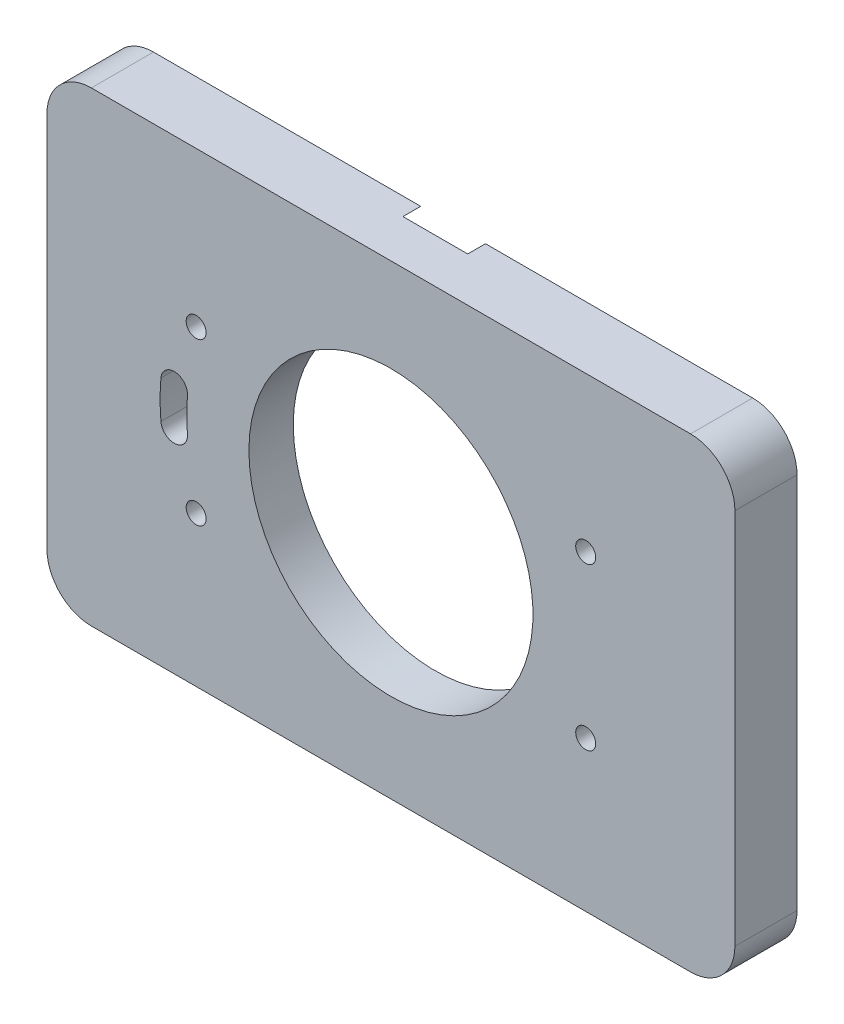
ISO-10303-21;
HEADER;
FILE_DESCRIPTION(('STEP AP214'),'2;1');
FILE_NAME('part.step','',(''),(''),'','','');
FILE_SCHEMA(('AUTOMOTIVE_DESIGN { 1 0 10303 214 1 1 1 1 }'));
ENDSEC;
DATA;
#1=APPLICATION_CONTEXT('core data for automotive mechanical design processes');
#2=APPLICATION_PROTOCOL_DEFINITION('international standard','automotive_design',2000,#1);
#3=PRODUCT_CONTEXT('',#1,'mechanical');
#4=PRODUCT('Part','Part','',(#3));
#5=PRODUCT_RELATED_PRODUCT_CATEGORY('part','',(#4));
#6=PRODUCT_DEFINITION_FORMATION('','',#4);
#7=PRODUCT_DEFINITION_CONTEXT('part definition',#1,'design');
#8=PRODUCT_DEFINITION('design','',#6,#7);
#9=PRODUCT_DEFINITION_SHAPE('','',#8);
#10=(LENGTH_UNIT() NAMED_UNIT(*) SI_UNIT(.MILLI.,.METRE.));
#11=(NAMED_UNIT(*) PLANE_ANGLE_UNIT() SI_UNIT($,.RADIAN.));
#12=(NAMED_UNIT(*) SI_UNIT($,.STERADIAN.) SOLID_ANGLE_UNIT());
#13=UNCERTAINTY_MEASURE_WITH_UNIT(LENGTH_MEASURE(1.E-05),#10,'distance_accuracy_value','');
#14=(GEOMETRIC_REPRESENTATION_CONTEXT(3) GLOBAL_UNCERTAINTY_ASSIGNED_CONTEXT((#13)) GLOBAL_UNIT_ASSIGNED_CONTEXT((#10,
#11,#12)) REPRESENTATION_CONTEXT('',''));
#15=CARTESIAN_POINT('',(0.,0.,0.));
#16=DIRECTION('',(0.,0.,1.));
#17=DIRECTION('',(1.,0.,0.));
#18=AXIS2_PLACEMENT_3D('',#15,#16,#17);
#19=CARTESIAN_POINT('',(43.884277794286,17.6774630373417,0.));
#20=DIRECTION('',(0.,0.,1.));
#21=DIRECTION('',(1.,0.,0.));
#22=AXIS2_PLACEMENT_3D('',#19,#20,#21);
#23=CYLINDRICAL_SURFACE('',#22,2.25);
#24=CARTESIAN_POINT('',(43.884277794286,17.6774630373417,14.));
#25=DIRECTION('',(0.,0.,1.));
#26=DIRECTION('',(1.,0.,0.));
#27=AXIS2_PLACEMENT_3D('',#24,#25,#26);
#28=CIRCLE('',#27,2.25);
#29=CARTESIAN_POINT('',(46.134277794286,17.6774630373417,14.));
#30=VERTEX_POINT('',#29);
#31=EDGE_CURVE('E182',#30,#30,#28,.T.);
#32=ORIENTED_EDGE('',*,*,#31,.T.);
#33=EDGE_LOOP('',(#32));
#34=FACE_BOUND('',#33,.T.);
#35=CARTESIAN_POINT('',(43.884277794286,17.6774630373417,6.5));
#36=DIRECTION('',(0.,0.,-1.));
#37=DIRECTION('',(-1.,0.,0.));
#38=AXIS2_PLACEMENT_3D('',#35,#36,#37);
#39=CIRCLE('',#38,2.25);
#40=CARTESIAN_POINT('',(41.634277794286,17.6774630373417,6.5));
#41=VERTEX_POINT('',#40);
#42=EDGE_CURVE('E36',#41,#41,#39,.F.);
#43=ORIENTED_EDGE('',*,*,#42,.F.);
#44=EDGE_LOOP('',(#43));
#45=FACE_BOUND('',#44,.T.);
#46=ADVANCED_FACE('F32',(#34,#45),#23,.F.);
#47=CARTESIAN_POINT('',(43.884277794286,-18.6774630373417,0.));
#48=DIRECTION('',(0.,0.,1.));
#49=DIRECTION('',(1.,0.,0.));
#50=AXIS2_PLACEMENT_3D('',#47,#48,#49);
#51=CYLINDRICAL_SURFACE('',#50,2.25);
#52=CARTESIAN_POINT('',(43.884277794286,-18.6774630373417,14.));
#53=DIRECTION('',(0.,0.,1.));
#54=DIRECTION('',(1.,0.,0.));
#55=AXIS2_PLACEMENT_3D('',#52,#53,#54);
#56=CIRCLE('',#55,2.25);
#57=CARTESIAN_POINT('',(46.134277794286,-18.6774630373417,14.));
#58=VERTEX_POINT('',#57);
#59=EDGE_CURVE('E179',#58,#58,#56,.T.);
#60=ORIENTED_EDGE('',*,*,#59,.T.);
#61=EDGE_LOOP('',(#60));
#62=FACE_BOUND('',#61,.T.);
#63=CARTESIAN_POINT('',(43.884277794286,-18.6774630373417,6.5));
#64=DIRECTION('',(0.,0.,-1.));
#65=DIRECTION('',(-1.,0.,0.));
#66=AXIS2_PLACEMENT_3D('',#63,#64,#65);
#67=CIRCLE('',#66,2.25);
#68=CARTESIAN_POINT('',(41.634277794286,-18.6774630373417,6.5));
#69=VERTEX_POINT('',#68);
#70=EDGE_CURVE('E165',#69,#69,#67,.F.);
#71=ORIENTED_EDGE('',*,*,#70,.F.);
#72=EDGE_LOOP('',(#71));
#73=FACE_BOUND('',#72,.T.);
#74=ADVANCED_FACE('F296',(#62,#73),#51,.F.);
#75=CARTESIAN_POINT('',(-43.884277794286,-18.6774630373418,0.));
#76=DIRECTION('',(0.,0.,1.));
#77=DIRECTION('',(1.,0.,0.));
#78=AXIS2_PLACEMENT_3D('',#75,#76,#77);
#79=CYLINDRICAL_SURFACE('',#78,2.25);
#80=CARTESIAN_POINT('',(-43.884277794286,-18.6774630373418,14.));
#81=DIRECTION('',(0.,0.,1.));
#82=DIRECTION('',(1.,0.,0.));
#83=AXIS2_PLACEMENT_3D('',#80,#81,#82);
#84=CIRCLE('',#83,2.25);
#85=CARTESIAN_POINT('',(-41.634277794286,-18.6774630373418,14.));
#86=VERTEX_POINT('',#85);
#87=EDGE_CURVE('E183',#86,#86,#84,.T.);
#88=ORIENTED_EDGE('',*,*,#87,.T.);
#89=EDGE_LOOP('',(#88));
#90=FACE_BOUND('',#89,.T.);
#91=CARTESIAN_POINT('',(-43.884277794286,-18.6774630373418,6.5));
#92=DIRECTION('',(0.,0.,-1.));
#93=DIRECTION('',(-1.,0.,0.));
#94=AXIS2_PLACEMENT_3D('',#91,#92,#93);
#95=CIRCLE('',#94,2.25);
#96=CARTESIAN_POINT('',(-46.134277794286,-18.6774630373418,6.5));
#97=VERTEX_POINT('',#96);
#98=EDGE_CURVE('E288',#97,#97,#95,.F.);
#99=ORIENTED_EDGE('',*,*,#98,.F.);
#100=EDGE_LOOP('',(#99));
#101=FACE_BOUND('',#100,.T.);
#102=ADVANCED_FACE('F298',(#90,#101),#79,.F.);
#103=CARTESIAN_POINT('',(-43.884277794286,17.6774630373417,0.));
#104=DIRECTION('',(0.,0.,1.));
#105=DIRECTION('',(1.,0.,0.));
#106=AXIS2_PLACEMENT_3D('',#103,#104,#105);
#107=CYLINDRICAL_SURFACE('',#106,2.25);
#108=CARTESIAN_POINT('',(-43.884277794286,17.6774630373417,14.));
#109=DIRECTION('',(0.,0.,1.));
#110=DIRECTION('',(1.,0.,0.));
#111=AXIS2_PLACEMENT_3D('',#108,#109,#110);
#112=CIRCLE('',#111,2.25);
#113=CARTESIAN_POINT('',(-41.634277794286,17.6774630373417,14.));
#114=VERTEX_POINT('',#113);
#115=EDGE_CURVE('E174',#114,#114,#112,.T.);
#116=ORIENTED_EDGE('',*,*,#115,.T.);
#117=EDGE_LOOP('',(#116));
#118=FACE_BOUND('',#117,.T.);
#119=CARTESIAN_POINT('',(-43.884277794286,17.6774630373417,6.5));
#120=DIRECTION('',(0.,0.,-1.));
#121=DIRECTION('',(-1.,0.,0.));
#122=AXIS2_PLACEMENT_3D('',#119,#120,#121);
#123=CIRCLE('',#122,2.25);
#124=CARTESIAN_POINT('',(-46.134277794286,17.6774630373417,6.5));
#125=VERTEX_POINT('',#124);
#126=EDGE_CURVE('E285',#125,#125,#123,.F.);
#127=ORIENTED_EDGE('',*,*,#126,.F.);
#128=EDGE_LOOP('',(#127));
#129=FACE_BOUND('',#128,.T.);
#130=ADVANCED_FACE('F305',(#118,#129),#107,.F.);
#131=CARTESIAN_POINT('',(0.,0.,14.));
#132=DIRECTION('',(0.,0.,1.));
#133=DIRECTION('',(1.,0.,0.));
#134=AXIS2_PLACEMENT_3D('',#131,#132,#133);
#135=PLANE('',#134);
#136=DIRECTION('',(1.,0.,0.));
#137=VECTOR('',#136,1.);
#138=CARTESIAN_POINT('',(-77.5,-52.5,14.));
#139=LINE('',#138,#137);
#140=CARTESIAN_POINT('',(-67.5,-52.5,14.));
#141=VERTEX_POINT('',#140);
#142=CARTESIAN_POINT('',(67.5,-52.5,14.));
#143=VERTEX_POINT('',#142);
#144=EDGE_CURVE('E225',#141,#143,#139,.T.);
#145=ORIENTED_EDGE('',*,*,#144,.T.);
#146=CARTESIAN_POINT('',(67.5,-42.5,14.));
#147=DIRECTION('',(0.,0.,1.));
#148=DIRECTION('',(1.,0.,0.));
#149=AXIS2_PLACEMENT_3D('',#146,#147,#148);
#150=CIRCLE('',#149,10.);
#151=CARTESIAN_POINT('',(77.5,-42.5,14.));
#152=VERTEX_POINT('',#151);
#153=EDGE_CURVE('E264',#143,#152,#150,.T.);
#154=ORIENTED_EDGE('',*,*,#153,.T.);
#155=DIRECTION('',(0.,1.,0.));
#156=VECTOR('',#155,1.);
#157=CARTESIAN_POINT('',(77.5,52.5,14.));
#158=LINE('',#157,#156);
#159=CARTESIAN_POINT('',(77.5,42.5,14.));
#160=VERTEX_POINT('',#159);
#161=EDGE_CURVE('E215',#152,#160,#158,.T.);
#162=ORIENTED_EDGE('',*,*,#161,.T.);
#163=CARTESIAN_POINT('',(67.5,42.5,14.));
#164=DIRECTION('',(0.,0.,1.));
#165=DIRECTION('',(1.,0.,0.));
#166=AXIS2_PLACEMENT_3D('',#163,#164,#165);
#167=CIRCLE('',#166,10.);
#168=CARTESIAN_POINT('',(67.5,52.5,14.));
#169=VERTEX_POINT('',#168);
#170=EDGE_CURVE('E262',#160,#169,#167,.T.);
#171=ORIENTED_EDGE('',*,*,#170,.T.);
#172=DIRECTION('',(-1.,0.,0.));
#173=VECTOR('',#172,1.);
#174=CARTESIAN_POINT('',(-77.5,52.5,14.));
#175=LINE('',#174,#173);
#176=CARTESIAN_POINT('',(-67.5,52.5,14.));
#177=VERTEX_POINT('',#176);
#178=EDGE_CURVE('E218',#169,#177,#175,.T.);
#179=ORIENTED_EDGE('',*,*,#178,.T.);
#180=CARTESIAN_POINT('',(-67.5,42.5,14.));
#181=DIRECTION('',(0.,0.,1.));
#182=DIRECTION('',(1.,0.,0.));
#183=AXIS2_PLACEMENT_3D('',#180,#181,#182);
#184=CIRCLE('',#183,10.);
#185=CARTESIAN_POINT('',(-77.5,42.5,14.));
#186=VERTEX_POINT('',#185);
#187=EDGE_CURVE('E258',#177,#186,#184,.T.);
#188=ORIENTED_EDGE('',*,*,#187,.T.);
#189=DIRECTION('',(0.,-1.,0.));
#190=VECTOR('',#189,1.);
#191=CARTESIAN_POINT('',(-77.5,52.5,14.));
#192=LINE('',#191,#190);
#193=CARTESIAN_POINT('',(-77.5,-42.5,14.));
#194=VERTEX_POINT('',#193);
#195=EDGE_CURVE('E222',#186,#194,#192,.T.);
#196=ORIENTED_EDGE('',*,*,#195,.T.);
#197=CARTESIAN_POINT('',(-67.5,-42.5,14.));
#198=DIRECTION('',(0.,0.,1.));
#199=DIRECTION('',(1.,0.,0.));
#200=AXIS2_PLACEMENT_3D('',#197,#198,#199);
#201=CIRCLE('',#200,10.);
#202=EDGE_CURVE('E260',#194,#141,#201,.T.);
#203=ORIENTED_EDGE('',*,*,#202,.T.);
#204=EDGE_LOOP('',(#145,#154,#162,#171,#179,#188,#196,#203));
#205=FACE_BOUND('',#204,.T.);
#206=CARTESIAN_POINT('',(0.,-0.500000000000007,14.));
#207=DIRECTION('',(0.,0.,-1.));
#208=DIRECTION('',(-1.,0.,0.));
#209=AXIS2_PLACEMENT_3D('',#206,#207,#208);
#210=CIRCLE('',#209,32.);
#211=CARTESIAN_POINT('',(-32.,-0.500000000000007,14.));
#212=VERTEX_POINT('',#211);
#213=EDGE_CURVE('E191',#212,#212,#210,.T.);
#214=ORIENTED_EDGE('',*,*,#213,.T.);
#215=EDGE_LOOP('',(#214));
#216=FACE_BOUND('',#215,.T.);
#217=ORIENTED_EDGE('',*,*,#31,.F.);
#218=EDGE_LOOP('',(#217));
#219=FACE_BOUND('',#218,.T.);
#220=ORIENTED_EDGE('',*,*,#59,.F.);
#221=EDGE_LOOP('',(#220));
#222=FACE_BOUND('',#221,.T.);
#223=ORIENTED_EDGE('',*,*,#87,.F.);
#224=EDGE_LOOP('',(#223));
#225=FACE_BOUND('',#224,.T.);
#226=ORIENTED_EDGE('',*,*,#115,.F.);
#227=EDGE_LOOP('',(#226));
#228=FACE_BOUND('',#227,.T.);
#229=CARTESIAN_POINT('',(-48.8364617882958,3.49999999999948,14.));
#230=DIRECTION('',(0.,0.,-1.));
#231=DIRECTION('',(-1.,0.,0.));
#232=AXIS2_PLACEMENT_3D('',#229,#230,#231);
#233=CIRCLE('',#232,2.99999999999887);
#234=CARTESIAN_POINT('',(-51.8264492447223,3.74489795918314,14.));
#235=VERTEX_POINT('',#234);
#236=CARTESIAN_POINT('',(-45.8464743318716,3.25510204081601,14.));
#237=VERTEX_POINT('',#236);
#238=EDGE_CURVE('E149',#235,#237,#233,.T.);
#239=ORIENTED_EDGE('',*,*,#238,.T.);
#240=CARTESIAN_POINT('',(1.84557201347179E-13,-0.5,14.));
#241=DIRECTION('',(0.,0.,1.));
#242=DIRECTION('',(-1.,0.,0.));
#243=AXIS2_PLACEMENT_3D('',#240,#241,#242);
#244=CIRCLE('',#243,45.9999999999991);
#245=CARTESIAN_POINT('',(-45.8464743318715,-4.255102040817,14.));
#246=VERTEX_POINT('',#245);
#247=EDGE_CURVE('E157',#237,#246,#244,.T.);
#248=ORIENTED_EDGE('',*,*,#247,.T.);
#249=CARTESIAN_POINT('',(-48.8364617882957,-4.50000000000052,14.));
#250=DIRECTION('',(0.,0.,-1.));
#251=DIRECTION('',(-1.,0.,0.));
#252=AXIS2_PLACEMENT_3D('',#249,#250,#251);
#253=CIRCLE('',#252,2.99999999999888);
#254=CARTESIAN_POINT('',(-51.8264492447211,-4.74489795918415,14.));
#255=VERTEX_POINT('',#254);
#256=EDGE_CURVE('E49',#246,#255,#253,.T.);
#257=ORIENTED_EDGE('',*,*,#256,.T.);
#258=CARTESIAN_POINT('',(1.84557201347179E-13,-0.5,14.));
#259=DIRECTION('',(0.,0.,-1.));
#260=DIRECTION('',(-1.,0.,0.));
#261=AXIS2_PLACEMENT_3D('',#258,#259,#260);
#262=CIRCLE('',#261,51.9999999999968);
#263=EDGE_CURVE('E154',#255,#235,#262,.T.);
#264=ORIENTED_EDGE('',*,*,#263,.T.);
#265=EDGE_LOOP('',(#239,#248,#257,#264));
#266=FACE_BOUND('',#265,.T.);
#267=ADVANCED_FACE('F161',(#205,#216,#219,#222,#225,#228,#266),#135,.T.);
#268=CARTESIAN_POINT('',(0.,-0.500000000000007,4.));
#269=DIRECTION('',(0.,0.,-1.));
#270=DIRECTION('',(-1.,0.,0.));
#271=AXIS2_PLACEMENT_3D('',#268,#269,#270);
#272=PLANE('',#271);
#273=CARTESIAN_POINT('',(-43.884277794286,-18.6774630373418,4.));
#274=DIRECTION('',(0.,0.,-1.));
#275=DIRECTION('',(-1.,0.,0.));
#276=AXIS2_PLACEMENT_3D('',#273,#274,#275);
#277=CIRCLE('',#276,5.);
#278=CARTESIAN_POINT('',(-48.8842777942859,-18.6774630373418,4.));
#279=VERTEX_POINT('',#278);
#280=EDGE_CURVE('E594',#279,#279,#277,.T.);
#281=ORIENTED_EDGE('',*,*,#280,.F.);
#282=EDGE_LOOP('',(#281));
#283=FACE_BOUND('',#282,.T.);
#284=CARTESIAN_POINT('',(43.884277794286,17.6774630373417,4.));
#285=DIRECTION('',(0.,0.,-1.));
#286=DIRECTION('',(-1.,0.,0.));
#287=AXIS2_PLACEMENT_3D('',#284,#285,#286);
#288=CIRCLE('',#287,5.);
#289=CARTESIAN_POINT('',(38.884277794286,17.6774630373417,4.));
#290=VERTEX_POINT('',#289);
#291=EDGE_CURVE('E590',#290,#290,#288,.T.);
#292=ORIENTED_EDGE('',*,*,#291,.F.);
#293=EDGE_LOOP('',(#292));
#294=FACE_BOUND('',#293,.T.);
#295=CARTESIAN_POINT('',(43.884277794286,-18.6774630373417,4.));
#296=DIRECTION('',(0.,0.,-1.));
#297=DIRECTION('',(-1.,0.,0.));
#298=AXIS2_PLACEMENT_3D('',#295,#296,#297);
#299=CIRCLE('',#298,5.);
#300=CARTESIAN_POINT('',(38.884277794286,-18.6774630373417,4.));
#301=VERTEX_POINT('',#300);
#302=EDGE_CURVE('E597',#301,#301,#299,.T.);
#303=ORIENTED_EDGE('',*,*,#302,.F.);
#304=EDGE_LOOP('',(#303));
#305=FACE_BOUND('',#304,.T.);
#306=CARTESIAN_POINT('',(-43.884277794286,17.6774630373417,4.));
#307=DIRECTION('',(0.,0.,-1.));
#308=DIRECTION('',(-1.,0.,0.));
#309=AXIS2_PLACEMENT_3D('',#306,#307,#308);
#310=CIRCLE('',#309,5.);
#311=CARTESIAN_POINT('',(-48.884277794286,17.6774630373417,4.));
#312=VERTEX_POINT('',#311);
#313=EDGE_CURVE('E167',#312,#312,#310,.T.);
#314=ORIENTED_EDGE('',*,*,#313,.F.);
#315=EDGE_LOOP('',(#314));
#316=FACE_BOUND('',#315,.T.);
#317=DIRECTION('',(1.,0.,0.));
#318=VECTOR('',#317,1.);
#319=CARTESIAN_POINT('',(-77.5,52.5,4.));
#320=LINE('',#319,#318);
#321=CARTESIAN_POINT('',(-7.29725975966321,52.5,4.));
#322=VERTEX_POINT('',#321);
#323=CARTESIAN_POINT('',(7.29725975966321,52.5,4.));
#324=VERTEX_POINT('',#323);
#325=EDGE_CURVE('E212',#322,#324,#320,.T.);
#326=ORIENTED_EDGE('',*,*,#325,.T.);
#327=CARTESIAN_POINT('',(0.,-0.500000000000007,4.));
#328=DIRECTION('',(0.,0.,-1.));
#329=DIRECTION('',(-1.,0.,0.));
#330=AXIS2_PLACEMENT_3D('',#327,#328,#329);
#331=CIRCLE('',#330,53.5);
#332=CARTESIAN_POINT('',(12.5797456254091,-52.5,4.));
#333=VERTEX_POINT('',#332);
#334=EDGE_CURVE('E199',#324,#333,#331,.T.);
#335=ORIENTED_EDGE('',*,*,#334,.T.);
#336=DIRECTION('',(-1.,0.,0.));
#337=VECTOR('',#336,1.);
#338=CARTESIAN_POINT('',(-77.5,-52.5,4.));
#339=LINE('',#338,#337);
#340=CARTESIAN_POINT('',(-12.5797456254091,-52.5,4.));
#341=VERTEX_POINT('',#340);
#342=EDGE_CURVE('E242',#333,#341,#339,.T.);
#343=ORIENTED_EDGE('',*,*,#342,.T.);
#344=EDGE_CURVE('E194',#341,#322,#331,.T.);
#345=ORIENTED_EDGE('',*,*,#344,.T.);
#346=EDGE_LOOP('',(#326,#335,#343,#345));
#347=FACE_BOUND('',#346,.T.);
#348=CARTESIAN_POINT('',(0.,-0.500000000000007,4.));
#349=DIRECTION('',(0.,0.,-1.));
#350=DIRECTION('',(-1.,0.,0.));
#351=AXIS2_PLACEMENT_3D('',#348,#349,#350);
#352=CIRCLE('',#351,32.);
#353=CARTESIAN_POINT('',(-32.,-0.500000000000007,4.));
#354=VERTEX_POINT('',#353);
#355=EDGE_CURVE('E190',#354,#354,#352,.T.);
#356=ORIENTED_EDGE('',*,*,#355,.F.);
#357=EDGE_LOOP('',(#356));
#358=FACE_BOUND('',#357,.T.);
#359=CARTESIAN_POINT('',(-48.8364617882958,3.49999999999948,4.));
#360=DIRECTION('',(0.,0.,-1.));
#361=DIRECTION('',(-1.,0.,0.));
#362=AXIS2_PLACEMENT_3D('',#359,#360,#361);
#363=CIRCLE('',#362,2.99999999999887);
#364=CARTESIAN_POINT('',(-51.8264492447223,3.74489795918314,4.));
#365=VERTEX_POINT('',#364);
#366=CARTESIAN_POINT('',(-45.8464743318716,3.25510204081601,4.));
#367=VERTEX_POINT('',#366);
#368=EDGE_CURVE('E11',#365,#367,#363,.T.);
#369=ORIENTED_EDGE('',*,*,#368,.F.);
#370=CARTESIAN_POINT('',(1.84557201347179E-13,-0.5,4.));
#371=DIRECTION('',(0.,0.,-1.));
#372=DIRECTION('',(-1.,0.,0.));
#373=AXIS2_PLACEMENT_3D('',#370,#371,#372);
#374=CIRCLE('',#373,51.9999999999968);
#375=CARTESIAN_POINT('',(-51.8264492447211,-4.74489795918415,4.));
#376=VERTEX_POINT('',#375);
#377=EDGE_CURVE('E41',#376,#365,#374,.T.);
#378=ORIENTED_EDGE('',*,*,#377,.F.);
#379=CARTESIAN_POINT('',(-48.8364617882957,-4.50000000000052,4.));
#380=DIRECTION('',(0.,0.,-1.));
#381=DIRECTION('',(-1.,0.,0.));
#382=AXIS2_PLACEMENT_3D('',#379,#380,#381);
#383=CIRCLE('',#382,2.99999999999888);
#384=CARTESIAN_POINT('',(-45.8464743318715,-4.255102040817,4.));
#385=VERTEX_POINT('',#384);
#386=EDGE_CURVE('E282',#385,#376,#383,.T.);
#387=ORIENTED_EDGE('',*,*,#386,.F.);
#388=CARTESIAN_POINT('',(1.84557201347179E-13,-0.5,4.));
#389=DIRECTION('',(0.,0.,-1.));
#390=DIRECTION('',(-1.,0.,0.));
#391=AXIS2_PLACEMENT_3D('',#388,#389,#390);
#392=CIRCLE('',#391,45.9999999999991);
#393=EDGE_CURVE('E280',#367,#385,#392,.F.);
#394=ORIENTED_EDGE('',*,*,#393,.F.);
#395=EDGE_LOOP('',(#369,#378,#387,#394));
#396=FACE_BOUND('',#395,.T.);
#397=ADVANCED_FACE('F322',(#283,#294,#305,#316,#347,#358,#396),#272,.T.);
#398=CARTESIAN_POINT('',(0.,0.,0.));
#399=DIRECTION('',(0.,0.,1.));
#400=DIRECTION('',(1.,0.,0.));
#401=AXIS2_PLACEMENT_3D('',#398,#399,#400);
#402=PLANE('',#401);
#403=DIRECTION('',(1.,0.,0.));
#404=VECTOR('',#403,1.);
#405=CARTESIAN_POINT('',(-77.5,-52.5,0.));
#406=LINE('',#405,#404);
#407=CARTESIAN_POINT('',(-67.5,-52.5,0.));
#408=VERTEX_POINT('',#407);
#409=CARTESIAN_POINT('',(-12.5797456254091,-52.5,0.));
#410=VERTEX_POINT('',#409);
#411=EDGE_CURVE('E219',#408,#410,#406,.T.);
#412=ORIENTED_EDGE('',*,*,#411,.F.);
#413=CARTESIAN_POINT('',(-67.5,-42.5,0.));
#414=DIRECTION('',(0.,0.,1.));
#415=DIRECTION('',(1.,0.,0.));
#416=AXIS2_PLACEMENT_3D('',#413,#414,#415);
#417=CIRCLE('',#416,10.);
#418=CARTESIAN_POINT('',(-77.5,-42.5,0.));
#419=VERTEX_POINT('',#418);
#420=EDGE_CURVE('E273',#408,#419,#417,.F.);
#421=ORIENTED_EDGE('',*,*,#420,.T.);
#422=DIRECTION('',(0.,-1.,0.));
#423=VECTOR('',#422,1.);
#424=CARTESIAN_POINT('',(-77.5,52.5,0.));
#425=LINE('',#424,#423);
#426=CARTESIAN_POINT('',(-77.5,42.5,0.));
#427=VERTEX_POINT('',#426);
#428=EDGE_CURVE('E234',#427,#419,#425,.T.);
#429=ORIENTED_EDGE('',*,*,#428,.F.);
#430=CARTESIAN_POINT('',(-67.5,42.5,0.));
#431=DIRECTION('',(0.,0.,1.));
#432=DIRECTION('',(1.,0.,0.));
#433=AXIS2_PLACEMENT_3D('',#430,#431,#432);
#434=CIRCLE('',#433,10.);
#435=CARTESIAN_POINT('',(-67.5,52.5,0.));
#436=VERTEX_POINT('',#435);
#437=EDGE_CURVE('E271',#427,#436,#434,.F.);
#438=ORIENTED_EDGE('',*,*,#437,.T.);
#439=DIRECTION('',(-1.,0.,0.));
#440=VECTOR('',#439,1.);
#441=CARTESIAN_POINT('',(-77.5,52.5,0.));
#442=LINE('',#441,#440);
#443=CARTESIAN_POINT('',(-7.29725975966321,52.5,0.));
#444=VERTEX_POINT('',#443);
#445=EDGE_CURVE('E231',#444,#436,#442,.T.);
#446=ORIENTED_EDGE('',*,*,#445,.F.);
#447=CARTESIAN_POINT('',(0.,-0.500000000000007,0.));
#448=DIRECTION('',(0.,0.,1.));
#449=DIRECTION('',(1.,0.,0.));
#450=AXIS2_PLACEMENT_3D('',#447,#448,#449);
#451=CIRCLE('',#450,53.5);
#452=EDGE_CURVE('E241',#444,#410,#451,.T.);
#453=ORIENTED_EDGE('',*,*,#452,.T.);
#454=EDGE_LOOP('',(#412,#421,#429,#438,#446,#453));
#455=FACE_BOUND('',#454,.T.);
#456=ADVANCED_FACE('F325',(#455),#402,.F.);
#457=CARTESIAN_POINT('',(77.5,52.5,14.));
#458=DIRECTION('',(-1.,0.,0.));
#459=DIRECTION('',(0.,-1.,0.));
#460=AXIS2_PLACEMENT_3D('',#457,#458,#459);
#461=PLANE('',#460);
#462=ORIENTED_EDGE('',*,*,#161,.F.);
#463=DIRECTION('',(0.,0.,-1.));
#464=VECTOR('',#463,1.);
#465=CARTESIAN_POINT('',(77.5,-42.5,14.));
#466=LINE('',#465,#464);
#467=CARTESIAN_POINT('',(77.5,-42.5,0.));
#468=VERTEX_POINT('',#467);
#469=EDGE_CURVE('E246',#152,#468,#466,.T.);
#470=ORIENTED_EDGE('',*,*,#469,.T.);
#471=DIRECTION('',(0.,1.,0.));
#472=VECTOR('',#471,1.);
#473=CARTESIAN_POINT('',(77.5,52.5,0.));
#474=LINE('',#473,#472);
#475=CARTESIAN_POINT('',(77.5,42.5,0.));
#476=VERTEX_POINT('',#475);
#477=EDGE_CURVE('E214',#468,#476,#474,.T.);
#478=ORIENTED_EDGE('',*,*,#477,.T.);
#479=DIRECTION('',(0.,0.,-1.));
#480=VECTOR('',#479,1.);
#481=CARTESIAN_POINT('',(77.5,42.5,14.));
#482=LINE('',#481,#480);
#483=EDGE_CURVE('E244',#476,#160,#482,.F.);
#484=ORIENTED_EDGE('',*,*,#483,.T.);
#485=EDGE_LOOP('',(#462,#470,#478,#484));
#486=FACE_BOUND('',#485,.T.);
#487=ADVANCED_FACE('F349',(#486),#461,.F.);
#488=CARTESIAN_POINT('',(-77.5,52.5,14.));
#489=DIRECTION('',(0.,-1.,0.));
#490=DIRECTION('',(0.,0.,-1.));
#491=AXIS2_PLACEMENT_3D('',#488,#489,#490);
#492=PLANE('',#491);
#493=ORIENTED_EDGE('',*,*,#178,.F.);
#494=DIRECTION('',(0.,0.,-1.));
#495=VECTOR('',#494,1.);
#496=CARTESIAN_POINT('',(67.5,52.5,14.));
#497=LINE('',#496,#495);
#498=CARTESIAN_POINT('',(67.5,52.5,0.));
#499=VERTEX_POINT('',#498);
#500=EDGE_CURVE('E268',#169,#499,#497,.T.);
#501=ORIENTED_EDGE('',*,*,#500,.T.);
#502=CARTESIAN_POINT('',(7.29725975966321,52.5,0.));
#503=VERTEX_POINT('',#502);
#504=EDGE_CURVE('E232',#499,#503,#442,.T.);
#505=ORIENTED_EDGE('',*,*,#504,.T.);
#506=DIRECTION('',(0.,0.,-1.));
#507=VECTOR('',#506,1.);
#508=CARTESIAN_POINT('',(7.29725975966321,52.5,4.));
#509=LINE('',#508,#507);
#510=EDGE_CURVE('E206',#503,#324,#509,.F.);
#511=ORIENTED_EDGE('',*,*,#510,.T.);
#512=ORIENTED_EDGE('',*,*,#325,.F.);
#513=DIRECTION('',(0.,0.,-1.));
#514=VECTOR('',#513,1.);
#515=CARTESIAN_POINT('',(-7.29725975966321,52.5,4.));
#516=LINE('',#515,#514);
#517=EDGE_CURVE('E209',#322,#444,#516,.T.);
#518=ORIENTED_EDGE('',*,*,#517,.T.);
#519=ORIENTED_EDGE('',*,*,#445,.T.);
#520=DIRECTION('',(0.,0.,-1.));
#521=VECTOR('',#520,1.);
#522=CARTESIAN_POINT('',(-67.5,52.5,14.));
#523=LINE('',#522,#521);
#524=EDGE_CURVE('E266',#436,#177,#523,.F.);
#525=ORIENTED_EDGE('',*,*,#524,.T.);
#526=EDGE_LOOP('',(#493,#501,#505,#511,#512,#518,#519,#525));
#527=FACE_BOUND('',#526,.T.);
#528=ADVANCED_FACE('F345',(#527),#492,.F.);
#529=CARTESIAN_POINT('',(-77.5,52.5,14.));
#530=DIRECTION('',(1.,0.,0.));
#531=DIRECTION('',(0.,1.,0.));
#532=AXIS2_PLACEMENT_3D('',#529,#530,#531);
#533=PLANE('',#532);
#534=ORIENTED_EDGE('',*,*,#428,.T.);
#535=DIRECTION('',(0.,0.,-1.));
#536=VECTOR('',#535,1.);
#537=CARTESIAN_POINT('',(-77.5,-42.5,14.));
#538=LINE('',#537,#536);
#539=EDGE_CURVE('E278',#419,#194,#538,.F.);
#540=ORIENTED_EDGE('',*,*,#539,.T.);
#541=ORIENTED_EDGE('',*,*,#195,.F.);
#542=DIRECTION('',(0.,0.,-1.));
#543=VECTOR('',#542,1.);
#544=CARTESIAN_POINT('',(-77.5,42.5,14.));
#545=LINE('',#544,#543);
#546=EDGE_CURVE('E275',#186,#427,#545,.T.);
#547=ORIENTED_EDGE('',*,*,#546,.T.);
#548=EDGE_LOOP('',(#534,#540,#541,#547));
#549=FACE_BOUND('',#548,.T.);
#550=ADVANCED_FACE('F341',(#549),#533,.F.);
#551=CARTESIAN_POINT('',(-77.5,-52.5,14.));
#552=DIRECTION('',(0.,1.,0.));
#553=DIRECTION('',(0.,0.,1.));
#554=AXIS2_PLACEMENT_3D('',#551,#552,#553);
#555=PLANE('',#554);
#556=CARTESIAN_POINT('',(12.5797456254091,-52.5,0.));
#557=VERTEX_POINT('',#556);
#558=CARTESIAN_POINT('',(67.5,-52.5,0.));
#559=VERTEX_POINT('',#558);
#560=EDGE_CURVE('E237',#557,#559,#406,.T.);
#561=ORIENTED_EDGE('',*,*,#560,.T.);
#562=DIRECTION('',(0.,0.,-1.));
#563=VECTOR('',#562,1.);
#564=CARTESIAN_POINT('',(67.5,-52.5,14.));
#565=LINE('',#564,#563);
#566=EDGE_CURVE('E256',#559,#143,#565,.F.);
#567=ORIENTED_EDGE('',*,*,#566,.T.);
#568=ORIENTED_EDGE('',*,*,#144,.F.);
#569=DIRECTION('',(0.,0.,-1.));
#570=VECTOR('',#569,1.);
#571=CARTESIAN_POINT('',(-67.5,-52.5,14.));
#572=LINE('',#571,#570);
#573=EDGE_CURVE('E253',#141,#408,#572,.T.);
#574=ORIENTED_EDGE('',*,*,#573,.T.);
#575=ORIENTED_EDGE('',*,*,#411,.T.);
#576=DIRECTION('',(0.,0.,-1.));
#577=VECTOR('',#576,1.);
#578=CARTESIAN_POINT('',(-12.5797456254091,-52.5,4.));
#579=LINE('',#578,#577);
#580=EDGE_CURVE('E200',#410,#341,#579,.F.);
#581=ORIENTED_EDGE('',*,*,#580,.T.);
#582=ORIENTED_EDGE('',*,*,#342,.F.);
#583=DIRECTION('',(0.,0.,-1.));
#584=VECTOR('',#583,1.);
#585=CARTESIAN_POINT('',(12.5797456254091,-52.5,4.));
#586=LINE('',#585,#584);
#587=EDGE_CURVE('E203',#333,#557,#586,.T.);
#588=ORIENTED_EDGE('',*,*,#587,.T.);
#589=EDGE_LOOP('',(#561,#567,#568,#574,#575,#581,#582,#588));
#590=FACE_BOUND('',#589,.T.);
#591=ADVANCED_FACE('F337',(#590),#555,.F.);
#592=ORIENTED_EDGE('',*,*,#477,.F.);
#593=CARTESIAN_POINT('',(67.5,-42.5,0.));
#594=DIRECTION('',(0.,0.,1.));
#595=DIRECTION('',(1.,0.,0.));
#596=AXIS2_PLACEMENT_3D('',#593,#594,#595);
#597=CIRCLE('',#596,10.);
#598=EDGE_CURVE('E251',#468,#559,#597,.F.);
#599=ORIENTED_EDGE('',*,*,#598,.T.);
#600=ORIENTED_EDGE('',*,*,#560,.F.);
#601=EDGE_CURVE('E228',#557,#503,#451,.T.);
#602=ORIENTED_EDGE('',*,*,#601,.T.);
#603=ORIENTED_EDGE('',*,*,#504,.F.);
#604=CARTESIAN_POINT('',(67.5,42.5,0.));
#605=DIRECTION('',(0.,0.,1.));
#606=DIRECTION('',(1.,0.,0.));
#607=AXIS2_PLACEMENT_3D('',#604,#605,#606);
#608=CIRCLE('',#607,10.);
#609=EDGE_CURVE('E249',#499,#476,#608,.F.);
#610=ORIENTED_EDGE('',*,*,#609,.T.);
#611=EDGE_LOOP('',(#592,#599,#600,#602,#603,#610));
#612=FACE_BOUND('',#611,.T.);
#613=ADVANCED_FACE('F330',(#612),#402,.F.);
#614=CARTESIAN_POINT('',(0.,-0.500000000000007,4.));
#615=DIRECTION('',(0.,0.,-1.));
#616=DIRECTION('',(-1.,0.,0.));
#617=AXIS2_PLACEMENT_3D('',#614,#615,#616);
#618=CYLINDRICAL_SURFACE('',#617,53.5);
#619=ORIENTED_EDGE('',*,*,#344,.F.);
#620=ORIENTED_EDGE('',*,*,#580,.F.);
#621=ORIENTED_EDGE('',*,*,#452,.F.);
#622=ORIENTED_EDGE('',*,*,#517,.F.);
#623=EDGE_LOOP('',(#619,#620,#621,#622));
#624=FACE_BOUND('',#623,.T.);
#625=ADVANCED_FACE('F327',(#624),#618,.F.);
#626=ORIENTED_EDGE('',*,*,#601,.F.);
#627=ORIENTED_EDGE('',*,*,#587,.F.);
#628=ORIENTED_EDGE('',*,*,#334,.F.);
#629=ORIENTED_EDGE('',*,*,#510,.F.);
#630=EDGE_LOOP('',(#626,#627,#628,#629));
#631=FACE_BOUND('',#630,.T.);
#632=ADVANCED_FACE('F320',(#631),#618,.F.);
#633=CARTESIAN_POINT('',(0.,-0.500000000000007,14.));
#634=DIRECTION('',(0.,0.,-1.));
#635=DIRECTION('',(-1.,0.,0.));
#636=AXIS2_PLACEMENT_3D('',#633,#634,#635);
#637=CYLINDRICAL_SURFACE('',#636,32.);
#638=ORIENTED_EDGE('',*,*,#213,.F.);
#639=EDGE_LOOP('',(#638));
#640=FACE_BOUND('',#639,.T.);
#641=ORIENTED_EDGE('',*,*,#355,.T.);
#642=EDGE_LOOP('',(#641));
#643=FACE_BOUND('',#642,.T.);
#644=ADVANCED_FACE('F316',(#640,#643),#637,.F.);
#645=CARTESIAN_POINT('',(67.5,-42.5,14.));
#646=DIRECTION('',(0.,0.,-1.));
#647=DIRECTION('',(-1.,0.,0.));
#648=AXIS2_PLACEMENT_3D('',#645,#646,#647);
#649=CYLINDRICAL_SURFACE('',#648,10.);
#650=ORIENTED_EDGE('',*,*,#153,.F.);
#651=ORIENTED_EDGE('',*,*,#566,.F.);
#652=ORIENTED_EDGE('',*,*,#598,.F.);
#653=ORIENTED_EDGE('',*,*,#469,.F.);
#654=EDGE_LOOP('',(#650,#651,#652,#653));
#655=FACE_BOUND('',#654,.T.);
#656=ADVANCED_FACE('F319',(#655),#649,.T.);
#657=CARTESIAN_POINT('',(67.5,42.5,14.));
#658=DIRECTION('',(0.,0.,-1.));
#659=DIRECTION('',(-1.,0.,0.));
#660=AXIS2_PLACEMENT_3D('',#657,#658,#659);
#661=CYLINDRICAL_SURFACE('',#660,10.);
#662=ORIENTED_EDGE('',*,*,#170,.F.);
#663=ORIENTED_EDGE('',*,*,#483,.F.);
#664=ORIENTED_EDGE('',*,*,#609,.F.);
#665=ORIENTED_EDGE('',*,*,#500,.F.);
#666=EDGE_LOOP('',(#662,#663,#664,#665));
#667=FACE_BOUND('',#666,.T.);
#668=ADVANCED_FACE('F356',(#667),#661,.T.);
#669=CARTESIAN_POINT('',(-67.5,-42.5,14.));
#670=DIRECTION('',(0.,0.,-1.));
#671=DIRECTION('',(-1.,0.,0.));
#672=AXIS2_PLACEMENT_3D('',#669,#670,#671);
#673=CYLINDRICAL_SURFACE('',#672,10.);
#674=ORIENTED_EDGE('',*,*,#202,.F.);
#675=ORIENTED_EDGE('',*,*,#539,.F.);
#676=ORIENTED_EDGE('',*,*,#420,.F.);
#677=ORIENTED_EDGE('',*,*,#573,.F.);
#678=EDGE_LOOP('',(#674,#675,#676,#677));
#679=FACE_BOUND('',#678,.T.);
#680=ADVANCED_FACE('F359',(#679),#673,.T.);
#681=CARTESIAN_POINT('',(-67.5,42.5,14.));
#682=DIRECTION('',(0.,0.,-1.));
#683=DIRECTION('',(-1.,0.,0.));
#684=AXIS2_PLACEMENT_3D('',#681,#682,#683);
#685=CYLINDRICAL_SURFACE('',#684,10.);
#686=ORIENTED_EDGE('',*,*,#187,.F.);
#687=ORIENTED_EDGE('',*,*,#524,.F.);
#688=ORIENTED_EDGE('',*,*,#437,.F.);
#689=ORIENTED_EDGE('',*,*,#546,.F.);
#690=EDGE_LOOP('',(#686,#687,#688,#689));
#691=FACE_BOUND('',#690,.T.);
#692=ADVANCED_FACE('F34',(#691),#685,.T.);
#693=CARTESIAN_POINT('',(-48.8364617882958,3.49999999999948,14.));
#694=DIRECTION('',(0.,0.,-1.));
#695=DIRECTION('',(-1.,0.,0.));
#696=AXIS2_PLACEMENT_3D('',#693,#694,#695);
#697=CYLINDRICAL_SURFACE('',#696,2.99999999999887);
#698=ORIENTED_EDGE('',*,*,#368,.T.);
#699=DIRECTION('',(0.,0.,-1.));
#700=VECTOR('',#699,1.);
#701=CARTESIAN_POINT('',(-45.8464743318716,3.25510204081601,14.));
#702=LINE('',#701,#700);
#703=EDGE_CURVE('E57',#237,#367,#702,.T.);
#704=ORIENTED_EDGE('',*,*,#703,.F.);
#705=ORIENTED_EDGE('',*,*,#238,.F.);
#706=DIRECTION('',(0.,0.,-1.));
#707=VECTOR('',#706,1.);
#708=CARTESIAN_POINT('',(-51.8264492447223,3.74489795918314,14.));
#709=LINE('',#708,#707);
#710=EDGE_CURVE('E172',#235,#365,#709,.T.);
#711=ORIENTED_EDGE('',*,*,#710,.T.);
#712=EDGE_LOOP('',(#698,#704,#705,#711));
#713=FACE_BOUND('',#712,.T.);
#714=ADVANCED_FACE('F146',(#713),#697,.F.);
#715=CARTESIAN_POINT('',(1.84557201347179E-13,-0.5,14.));
#716=DIRECTION('',(0.,0.,-1.));
#717=DIRECTION('',(-1.,0.,0.));
#718=AXIS2_PLACEMENT_3D('',#715,#716,#717);
#719=CYLINDRICAL_SURFACE('',#718,51.9999999999968);
#720=ORIENTED_EDGE('',*,*,#377,.T.);
#721=ORIENTED_EDGE('',*,*,#710,.F.);
#722=ORIENTED_EDGE('',*,*,#263,.F.);
#723=DIRECTION('',(0.,0.,-1.));
#724=VECTOR('',#723,1.);
#725=CARTESIAN_POINT('',(-51.8264492447211,-4.74489795918415,14.));
#726=LINE('',#725,#724);
#727=EDGE_CURVE('E175',#255,#376,#726,.T.);
#728=ORIENTED_EDGE('',*,*,#727,.T.);
#729=EDGE_LOOP('',(#720,#721,#722,#728));
#730=FACE_BOUND('',#729,.T.);
#731=ADVANCED_FACE('F449',(#730),#719,.F.);
#732=CARTESIAN_POINT('',(-48.8364617882957,-4.50000000000052,14.));
#733=DIRECTION('',(0.,0.,-1.));
#734=DIRECTION('',(-1.,0.,0.));
#735=AXIS2_PLACEMENT_3D('',#732,#733,#734);
#736=CYLINDRICAL_SURFACE('',#735,2.99999999999888);
#737=ORIENTED_EDGE('',*,*,#386,.T.);
#738=ORIENTED_EDGE('',*,*,#727,.F.);
#739=ORIENTED_EDGE('',*,*,#256,.F.);
#740=DIRECTION('',(0.,0.,-1.));
#741=VECTOR('',#740,1.);
#742=CARTESIAN_POINT('',(-45.8464743318715,-4.255102040817,14.));
#743=LINE('',#742,#741);
#744=EDGE_CURVE('E153',#246,#385,#743,.T.);
#745=ORIENTED_EDGE('',*,*,#744,.T.);
#746=EDGE_LOOP('',(#737,#738,#739,#745));
#747=FACE_BOUND('',#746,.T.);
#748=ADVANCED_FACE('F457',(#747),#736,.F.);
#749=CARTESIAN_POINT('',(1.84557201347179E-13,-0.5,14.));
#750=DIRECTION('',(0.,0.,-1.));
#751=DIRECTION('',(-1.,0.,0.));
#752=AXIS2_PLACEMENT_3D('',#749,#750,#751);
#753=CYLINDRICAL_SURFACE('',#752,45.9999999999991);
#754=ORIENTED_EDGE('',*,*,#393,.T.);
#755=ORIENTED_EDGE('',*,*,#744,.F.);
#756=ORIENTED_EDGE('',*,*,#247,.F.);
#757=ORIENTED_EDGE('',*,*,#703,.T.);
#758=EDGE_LOOP('',(#754,#755,#756,#757));
#759=FACE_BOUND('',#758,.T.);
#760=ADVANCED_FACE('F158',(#759),#753,.T.);
#761=CARTESIAN_POINT('',(-43.884277794286,17.6774630373417,6.5));
#762=DIRECTION('',(0.,0.,-1.));
#763=DIRECTION('',(-1.,0.,0.));
#764=AXIS2_PLACEMENT_3D('',#761,#762,#763);
#765=PLANE('',#764);
#766=CARTESIAN_POINT('',(-43.884277794286,17.6774630373417,6.5));
#767=DIRECTION('',(0.,0.,-1.));
#768=DIRECTION('',(-1.,0.,0.));
#769=AXIS2_PLACEMENT_3D('',#766,#767,#768);
#770=CIRCLE('',#769,5.);
#771=CARTESIAN_POINT('',(-48.884277794286,17.6774630373417,6.5));
#772=VERTEX_POINT('',#771);
#773=EDGE_CURVE('E289',#772,#772,#770,.T.);
#774=ORIENTED_EDGE('',*,*,#773,.T.);
#775=EDGE_LOOP('',(#774));
#776=FACE_BOUND('',#775,.T.);
#777=ORIENTED_EDGE('',*,*,#126,.T.);
#778=EDGE_LOOP('',(#777));
#779=FACE_BOUND('',#778,.T.);
#780=ADVANCED_FACE('F475',(#776,#779),#765,.T.);
#781=CARTESIAN_POINT('',(-43.884277794286,17.6774630373417,6.5));
#782=DIRECTION('',(0.,0.,-1.));
#783=DIRECTION('',(-1.,0.,0.));
#784=AXIS2_PLACEMENT_3D('',#781,#782,#783);
#785=CYLINDRICAL_SURFACE('',#784,5.);
#786=ORIENTED_EDGE('',*,*,#773,.F.);
#787=EDGE_LOOP('',(#786));
#788=FACE_BOUND('',#787,.T.);
#789=ORIENTED_EDGE('',*,*,#313,.T.);
#790=EDGE_LOOP('',(#789));
#791=FACE_BOUND('',#790,.T.);
#792=ADVANCED_FACE('F511',(#788,#791),#785,.F.);
#793=CARTESIAN_POINT('',(-43.884277794286,-18.6774630373418,6.5));
#794=DIRECTION('',(0.,0.,-1.));
#795=DIRECTION('',(-1.,0.,0.));
#796=AXIS2_PLACEMENT_3D('',#793,#794,#795);
#797=PLANE('',#796);
#798=CARTESIAN_POINT('',(-43.884277794286,-18.6774630373418,6.5));
#799=DIRECTION('',(0.,0.,-1.));
#800=DIRECTION('',(-1.,0.,0.));
#801=AXIS2_PLACEMENT_3D('',#798,#799,#800);
#802=CIRCLE('',#801,5.);
#803=CARTESIAN_POINT('',(-48.8842777942859,-18.6774630373418,6.5));
#804=VERTEX_POINT('',#803);
#805=EDGE_CURVE('E603',#804,#804,#802,.T.);
#806=ORIENTED_EDGE('',*,*,#805,.T.);
#807=EDGE_LOOP('',(#806));
#808=FACE_BOUND('',#807,.T.);
#809=ORIENTED_EDGE('',*,*,#98,.T.);
#810=EDGE_LOOP('',(#809));
#811=FACE_BOUND('',#810,.T.);
#812=ADVANCED_FACE('F521',(#808,#811),#797,.T.);
#813=CARTESIAN_POINT('',(-43.884277794286,-18.6774630373418,6.5));
#814=DIRECTION('',(0.,0.,-1.));
#815=DIRECTION('',(-1.,0.,0.));
#816=AXIS2_PLACEMENT_3D('',#813,#814,#815);
#817=CYLINDRICAL_SURFACE('',#816,5.);
#818=ORIENTED_EDGE('',*,*,#805,.F.);
#819=EDGE_LOOP('',(#818));
#820=FACE_BOUND('',#819,.T.);
#821=ORIENTED_EDGE('',*,*,#280,.T.);
#822=EDGE_LOOP('',(#821));
#823=FACE_BOUND('',#822,.T.);
#824=ADVANCED_FACE('F531',(#820,#823),#817,.F.);
#825=CARTESIAN_POINT('',(43.884277794286,-18.6774630373417,6.5));
#826=DIRECTION('',(0.,0.,-1.));
#827=DIRECTION('',(-1.,0.,0.));
#828=AXIS2_PLACEMENT_3D('',#825,#826,#827);
#829=PLANE('',#828);
#830=CARTESIAN_POINT('',(43.884277794286,-18.6774630373417,6.5));
#831=DIRECTION('',(0.,0.,-1.));
#832=DIRECTION('',(-1.,0.,0.));
#833=AXIS2_PLACEMENT_3D('',#830,#831,#832);
#834=CIRCLE('',#833,5.);
#835=CARTESIAN_POINT('',(38.884277794286,-18.6774630373417,6.5));
#836=VERTEX_POINT('',#835);
#837=EDGE_CURVE('E592',#836,#836,#834,.T.);
#838=ORIENTED_EDGE('',*,*,#837,.T.);
#839=EDGE_LOOP('',(#838));
#840=FACE_BOUND('',#839,.T.);
#841=ORIENTED_EDGE('',*,*,#70,.T.);
#842=EDGE_LOOP('',(#841));
#843=FACE_BOUND('',#842,.T.);
#844=ADVANCED_FACE('F294',(#840,#843),#829,.T.);
#845=CARTESIAN_POINT('',(43.884277794286,-18.6774630373417,6.5));
#846=DIRECTION('',(0.,0.,-1.));
#847=DIRECTION('',(-1.,0.,0.));
#848=AXIS2_PLACEMENT_3D('',#845,#846,#847);
#849=CYLINDRICAL_SURFACE('',#848,5.);
#850=ORIENTED_EDGE('',*,*,#837,.F.);
#851=EDGE_LOOP('',(#850));
#852=FACE_BOUND('',#851,.T.);
#853=ORIENTED_EDGE('',*,*,#302,.T.);
#854=EDGE_LOOP('',(#853));
#855=FACE_BOUND('',#854,.T.);
#856=ADVANCED_FACE('F550',(#852,#855),#849,.F.);
#857=CARTESIAN_POINT('',(43.884277794286,17.6774630373417,6.5));
#858=DIRECTION('',(0.,0.,-1.));
#859=DIRECTION('',(-1.,0.,0.));
#860=AXIS2_PLACEMENT_3D('',#857,#858,#859);
#861=PLANE('',#860);
#862=CARTESIAN_POINT('',(43.884277794286,17.6774630373417,6.5));
#863=DIRECTION('',(0.,0.,-1.));
#864=DIRECTION('',(-1.,0.,0.));
#865=AXIS2_PLACEMENT_3D('',#862,#863,#864);
#866=CIRCLE('',#865,5.);
#867=CARTESIAN_POINT('',(38.884277794286,17.6774630373417,6.5));
#868=VERTEX_POINT('',#867);
#869=EDGE_CURVE('E587',#868,#868,#866,.T.);
#870=ORIENTED_EDGE('',*,*,#869,.T.);
#871=EDGE_LOOP('',(#870));
#872=FACE_BOUND('',#871,.T.);
#873=ORIENTED_EDGE('',*,*,#42,.T.);
#874=EDGE_LOOP('',(#873));
#875=FACE_BOUND('',#874,.T.);
#876=ADVANCED_FACE('F560',(#872,#875),#861,.T.);
#877=CARTESIAN_POINT('',(43.884277794286,17.6774630373417,6.5));
#878=DIRECTION('',(0.,0.,-1.));
#879=DIRECTION('',(-1.,0.,0.));
#880=AXIS2_PLACEMENT_3D('',#877,#878,#879);
#881=CYLINDRICAL_SURFACE('',#880,5.);
#882=ORIENTED_EDGE('',*,*,#869,.F.);
#883=EDGE_LOOP('',(#882));
#884=FACE_BOUND('',#883,.T.);
#885=ORIENTED_EDGE('',*,*,#291,.T.);
#886=EDGE_LOOP('',(#885));
#887=FACE_BOUND('',#886,.T.);
#888=ADVANCED_FACE('F570',(#884,#887),#881,.F.);
#889=CLOSED_SHELL('',(#46,#74,#102,#130,#267,#397,#456,#487,#528,#550,#591,#613,#625,#632,#644,
#656,#668,#680,#692,#714,#731,#748,#760,#780,#792,#812,#824,#844,#856,#876,#888));
#890=MANIFOLD_SOLID_BREP('B2',#889);
#891=ADVANCED_BREP_SHAPE_REPRESENTATION('',(#18,#890),#14);
#892=SHAPE_DEFINITION_REPRESENTATION(#9,#891);
ENDSEC;
END-ISO-10303-21;
